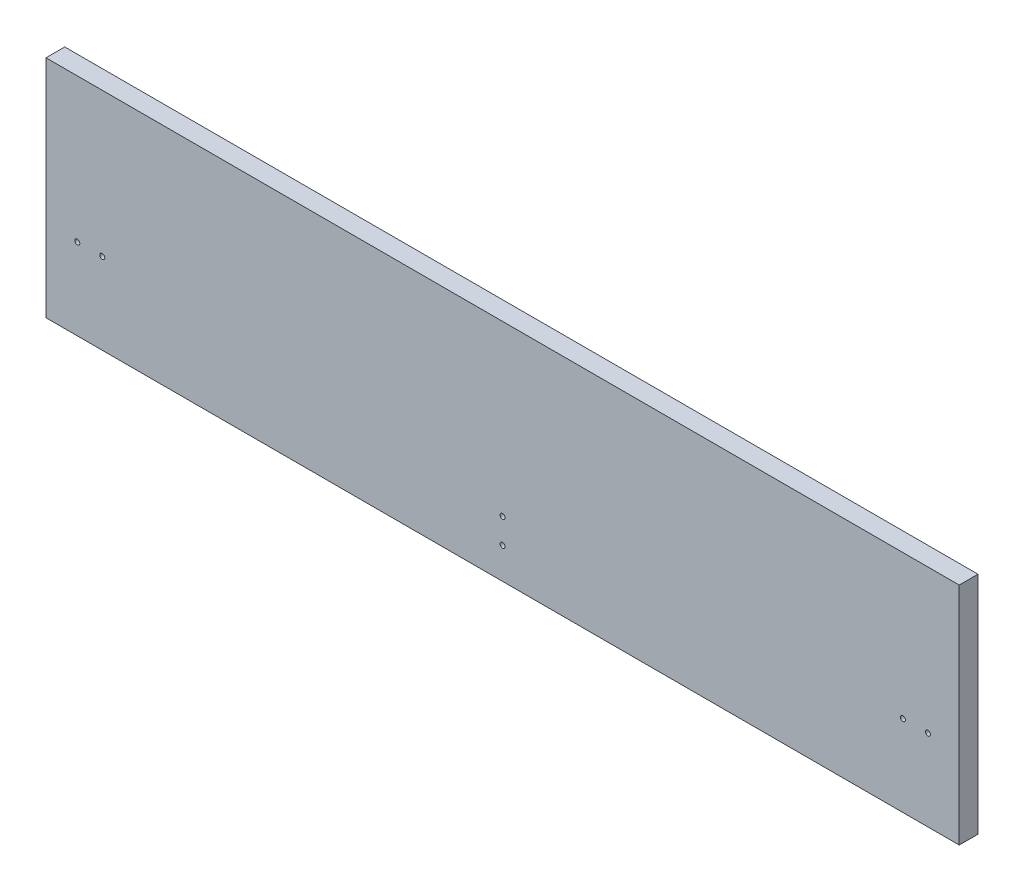
ISO-10303-21;
HEADER;
FILE_DESCRIPTION(('STEP AP214'),'2;1');
FILE_NAME('part.step','',(''),(''),'','','');
FILE_SCHEMA(('AUTOMOTIVE_DESIGN { 1 0 10303 214 1 1 1 1 }'));
ENDSEC;
DATA;
#1=APPLICATION_CONTEXT('core data for automotive mechanical design processes');
#2=APPLICATION_PROTOCOL_DEFINITION('international standard','automotive_design',2000,#1);
#3=PRODUCT_CONTEXT('',#1,'mechanical');
#4=PRODUCT('Part','Part','',(#3));
#5=PRODUCT_RELATED_PRODUCT_CATEGORY('part','',(#4));
#6=PRODUCT_DEFINITION_FORMATION('','',#4);
#7=PRODUCT_DEFINITION_CONTEXT('part definition',#1,'design');
#8=PRODUCT_DEFINITION('design','',#6,#7);
#9=PRODUCT_DEFINITION_SHAPE('','',#8);
#10=(LENGTH_UNIT() NAMED_UNIT(*) SI_UNIT(.MILLI.,.METRE.));
#11=(NAMED_UNIT(*) PLANE_ANGLE_UNIT() SI_UNIT($,.RADIAN.));
#12=(NAMED_UNIT(*) SI_UNIT($,.STERADIAN.) SOLID_ANGLE_UNIT());
#13=UNCERTAINTY_MEASURE_WITH_UNIT(LENGTH_MEASURE(1.E-05),#10,'distance_accuracy_value','');
#14=(GEOMETRIC_REPRESENTATION_CONTEXT(3) GLOBAL_UNCERTAINTY_ASSIGNED_CONTEXT((#13)) GLOBAL_UNIT_ASSIGNED_CONTEXT((#10,
#11,#12)) REPRESENTATION_CONTEXT('',''));
#15=CARTESIAN_POINT('',(0.,0.,0.));
#16=DIRECTION('',(0.,0.,1.));
#17=DIRECTION('',(1.,0.,0.));
#18=AXIS2_PLACEMENT_3D('',#15,#16,#17);
#19=CARTESIAN_POINT('',(365.,-90.,15.));
#20=DIRECTION('',(-1.,0.,0.));
#21=DIRECTION('',(0.,-1.,0.));
#22=AXIS2_PLACEMENT_3D('',#19,#20,#21);
#23=PLANE('',#22);
#24=DIRECTION('',(0.,1.,0.));
#25=VECTOR('',#24,1.);
#26=CARTESIAN_POINT('',(365.,-90.,0.));
#27=LINE('',#26,#25);
#28=CARTESIAN_POINT('',(365.,-90.,0.));
#29=VERTEX_POINT('',#28);
#30=CARTESIAN_POINT('',(365.,90.,0.));
#31=VERTEX_POINT('',#30);
#32=EDGE_CURVE('E95',#29,#31,#27,.T.);
#33=ORIENTED_EDGE('',*,*,#32,.T.);
#34=DIRECTION('',(0.,0.,-1.));
#35=VECTOR('',#34,1.);
#36=CARTESIAN_POINT('',(365.,90.,15.));
#37=LINE('',#36,#35);
#38=CARTESIAN_POINT('',(365.,90.,15.));
#39=VERTEX_POINT('',#38);
#40=EDGE_CURVE('E11',#39,#31,#37,.T.);
#41=ORIENTED_EDGE('',*,*,#40,.F.);
#42=DIRECTION('',(0.,1.,0.));
#43=VECTOR('',#42,1.);
#44=CARTESIAN_POINT('',(365.,-90.,15.));
#45=LINE('',#44,#43);
#46=CARTESIAN_POINT('',(365.,-90.,15.));
#47=VERTEX_POINT('',#46);
#48=EDGE_CURVE('E83',#47,#39,#45,.T.);
#49=ORIENTED_EDGE('',*,*,#48,.F.);
#50=DIRECTION('',(0.,0.,-1.));
#51=VECTOR('',#50,1.);
#52=CARTESIAN_POINT('',(365.,-90.,15.));
#53=LINE('',#52,#51);
#54=EDGE_CURVE('E91',#47,#29,#53,.T.);
#55=ORIENTED_EDGE('',*,*,#54,.T.);
#56=EDGE_LOOP('',(#33,#41,#49,#55));
#57=FACE_BOUND('',#56,.T.);
#58=ADVANCED_FACE('F32',(#57),#23,.F.);
#59=CARTESIAN_POINT('',(-365.,90.,15.));
#60=DIRECTION('',(0.,-1.,0.));
#61=DIRECTION('',(0.,0.,-1.));
#62=AXIS2_PLACEMENT_3D('',#59,#60,#61);
#63=PLANE('',#62);
#64=DIRECTION('',(-1.,0.,0.));
#65=VECTOR('',#64,1.);
#66=CARTESIAN_POINT('',(-365.,90.,0.));
#67=LINE('',#66,#65);
#68=CARTESIAN_POINT('',(-365.,90.,0.));
#69=VERTEX_POINT('',#68);
#70=EDGE_CURVE('E87',#31,#69,#67,.T.);
#71=ORIENTED_EDGE('',*,*,#70,.T.);
#72=DIRECTION('',(0.,0.,-1.));
#73=VECTOR('',#72,1.);
#74=CARTESIAN_POINT('',(-365.,90.,15.));
#75=LINE('',#74,#73);
#76=CARTESIAN_POINT('',(-365.,90.,15.));
#77=VERTEX_POINT('',#76);
#78=EDGE_CURVE('E40',#77,#69,#75,.T.);
#79=ORIENTED_EDGE('',*,*,#78,.F.);
#80=DIRECTION('',(-1.,0.,0.));
#81=VECTOR('',#80,1.);
#82=CARTESIAN_POINT('',(-365.,90.,15.));
#83=LINE('',#82,#81);
#84=EDGE_CURVE('E78',#39,#77,#83,.T.);
#85=ORIENTED_EDGE('',*,*,#84,.F.);
#86=ORIENTED_EDGE('',*,*,#40,.T.);
#87=EDGE_LOOP('',(#71,#79,#85,#86));
#88=FACE_BOUND('',#87,.T.);
#89=ADVANCED_FACE('F86',(#88),#63,.F.);
#90=CARTESIAN_POINT('',(-365.,-90.,15.));
#91=DIRECTION('',(1.,0.,0.));
#92=DIRECTION('',(0.,1.,0.));
#93=AXIS2_PLACEMENT_3D('',#90,#91,#92);
#94=PLANE('',#93);
#95=DIRECTION('',(0.,-1.,0.));
#96=VECTOR('',#95,1.);
#97=CARTESIAN_POINT('',(-365.,-90.,0.));
#98=LINE('',#97,#96);
#99=CARTESIAN_POINT('',(-365.,-90.,0.));
#100=VERTEX_POINT('',#99);
#101=EDGE_CURVE('E65',#69,#100,#98,.T.);
#102=ORIENTED_EDGE('',*,*,#101,.T.);
#103=DIRECTION('',(0.,0.,-1.));
#104=VECTOR('',#103,1.);
#105=CARTESIAN_POINT('',(-365.,-90.,15.));
#106=LINE('',#105,#104);
#107=CARTESIAN_POINT('',(-365.,-90.,15.));
#108=VERTEX_POINT('',#107);
#109=EDGE_CURVE('E88',#108,#100,#106,.T.);
#110=ORIENTED_EDGE('',*,*,#109,.F.);
#111=DIRECTION('',(0.,-1.,0.));
#112=VECTOR('',#111,1.);
#113=CARTESIAN_POINT('',(-365.,-90.,15.));
#114=LINE('',#113,#112);
#115=EDGE_CURVE('E81',#77,#108,#114,.T.);
#116=ORIENTED_EDGE('',*,*,#115,.F.);
#117=ORIENTED_EDGE('',*,*,#78,.T.);
#118=EDGE_LOOP('',(#102,#110,#116,#117));
#119=FACE_BOUND('',#118,.T.);
#120=ADVANCED_FACE('F89',(#119),#94,.F.);
#121=CARTESIAN_POINT('',(-365.,-90.,15.));
#122=DIRECTION('',(0.,1.,0.));
#123=DIRECTION('',(0.,0.,1.));
#124=AXIS2_PLACEMENT_3D('',#121,#122,#123);
#125=PLANE('',#124);
#126=DIRECTION('',(1.,0.,0.));
#127=VECTOR('',#126,1.);
#128=CARTESIAN_POINT('',(-365.,-90.,0.));
#129=LINE('',#128,#127);
#130=EDGE_CURVE('E71',#100,#29,#129,.T.);
#131=ORIENTED_EDGE('',*,*,#130,.T.);
#132=ORIENTED_EDGE('',*,*,#54,.F.);
#133=DIRECTION('',(1.,0.,0.));
#134=VECTOR('',#133,1.);
#135=CARTESIAN_POINT('',(-365.,-90.,15.));
#136=LINE('',#135,#134);
#137=EDGE_CURVE('E48',#108,#47,#136,.T.);
#138=ORIENTED_EDGE('',*,*,#137,.F.);
#139=ORIENTED_EDGE('',*,*,#109,.T.);
#140=EDGE_LOOP('',(#131,#132,#138,#139));
#141=FACE_BOUND('',#140,.T.);
#142=ADVANCED_FACE('F103',(#141),#125,.F.);
#143=CARTESIAN_POINT('',(0.,0.,15.));
#144=DIRECTION('',(0.,0.,-1.));
#145=DIRECTION('',(-1.,0.,0.));
#146=AXIS2_PLACEMENT_3D('',#143,#144,#145);
#147=PLANE('',#146);
#148=CARTESIAN_POINT('',(320.,-24.9999999999999,15.));
#149=DIRECTION('',(0.,0.,1.));
#150=DIRECTION('',(1.,0.,0.));
#151=AXIS2_PLACEMENT_3D('',#148,#149,#150);
#152=CIRCLE('',#151,2.);
#153=CARTESIAN_POINT('',(322.,-24.9999999999999,15.));
#154=VERTEX_POINT('',#153);
#155=EDGE_CURVE('E139',#154,#154,#152,.T.);
#156=ORIENTED_EDGE('',*,*,#155,.F.);
#157=EDGE_LOOP('',(#156));
#158=FACE_BOUND('',#157,.T.);
#159=CARTESIAN_POINT('',(340.,-25.,15.));
#160=DIRECTION('',(0.,0.,1.));
#161=DIRECTION('',(1.,0.,0.));
#162=AXIS2_PLACEMENT_3D('',#159,#160,#161);
#163=CIRCLE('',#162,2.);
#164=CARTESIAN_POINT('',(342.,-25.,15.));
#165=VERTEX_POINT('',#164);
#166=EDGE_CURVE('E133',#165,#165,#163,.T.);
#167=ORIENTED_EDGE('',*,*,#166,.F.);
#168=EDGE_LOOP('',(#167));
#169=FACE_BOUND('',#168,.T.);
#170=CARTESIAN_POINT('',(-320.,-25.,15.));
#171=DIRECTION('',(0.,0.,1.));
#172=DIRECTION('',(1.,0.,0.));
#173=AXIS2_PLACEMENT_3D('',#170,#171,#172);
#174=CIRCLE('',#173,2.);
#175=CARTESIAN_POINT('',(-318.,-25.,15.));
#176=VERTEX_POINT('',#175);
#177=EDGE_CURVE('E127',#176,#176,#174,.T.);
#178=ORIENTED_EDGE('',*,*,#177,.F.);
#179=EDGE_LOOP('',(#178));
#180=FACE_BOUND('',#179,.T.);
#181=CARTESIAN_POINT('',(0.,-45.,15.));
#182=DIRECTION('',(0.,0.,1.));
#183=DIRECTION('',(1.,0.,0.));
#184=AXIS2_PLACEMENT_3D('',#181,#182,#183);
#185=CIRCLE('',#184,2.);
#186=CARTESIAN_POINT('',(2.,-45.,15.));
#187=VERTEX_POINT('',#186);
#188=EDGE_CURVE('E121',#187,#187,#185,.T.);
#189=ORIENTED_EDGE('',*,*,#188,.F.);
#190=EDGE_LOOP('',(#189));
#191=FACE_BOUND('',#190,.T.);
#192=CARTESIAN_POINT('',(0.,-65.,15.));
#193=DIRECTION('',(0.,0.,1.));
#194=DIRECTION('',(1.,0.,0.));
#195=AXIS2_PLACEMENT_3D('',#192,#193,#194);
#196=CIRCLE('',#195,2.);
#197=CARTESIAN_POINT('',(2.,-65.,15.));
#198=VERTEX_POINT('',#197);
#199=EDGE_CURVE('E115',#198,#198,#196,.T.);
#200=ORIENTED_EDGE('',*,*,#199,.F.);
#201=EDGE_LOOP('',(#200));
#202=FACE_BOUND('',#201,.T.);
#203=CARTESIAN_POINT('',(-340.,-25.,15.));
#204=DIRECTION('',(0.,0.,1.));
#205=DIRECTION('',(1.,0.,0.));
#206=AXIS2_PLACEMENT_3D('',#203,#204,#205);
#207=CIRCLE('',#206,2.);
#208=CARTESIAN_POINT('',(-338.,-25.,15.));
#209=VERTEX_POINT('',#208);
#210=EDGE_CURVE('E109',#209,#209,#207,.T.);
#211=ORIENTED_EDGE('',*,*,#210,.F.);
#212=EDGE_LOOP('',(#211));
#213=FACE_BOUND('',#212,.T.);
#214=ORIENTED_EDGE('',*,*,#48,.T.);
#215=ORIENTED_EDGE('',*,*,#84,.T.);
#216=ORIENTED_EDGE('',*,*,#115,.T.);
#217=ORIENTED_EDGE('',*,*,#137,.T.);
#218=EDGE_LOOP('',(#214,#215,#216,#217));
#219=FACE_BOUND('',#218,.T.);
#220=ADVANCED_FACE('F79',(#158,#169,#180,#191,#202,#213,#219),#147,.F.);
#221=CARTESIAN_POINT('',(0.,0.,0.));
#222=DIRECTION('',(0.,0.,-1.));
#223=DIRECTION('',(-1.,0.,0.));
#224=AXIS2_PLACEMENT_3D('',#221,#222,#223);
#225=PLANE('',#224);
#226=ORIENTED_EDGE('',*,*,#32,.F.);
#227=ORIENTED_EDGE('',*,*,#130,.F.);
#228=ORIENTED_EDGE('',*,*,#101,.F.);
#229=ORIENTED_EDGE('',*,*,#70,.F.);
#230=EDGE_LOOP('',(#226,#227,#228,#229));
#231=FACE_BOUND('',#230,.T.);
#232=ADVANCED_FACE('F106',(#231),#225,.T.);
#233=CARTESIAN_POINT('',(-340.,-25.,5.));
#234=DIRECTION('',(0.,0.,1.));
#235=DIRECTION('',(1.,0.,0.));
#236=AXIS2_PLACEMENT_3D('',#233,#234,#235);
#237=CYLINDRICAL_SURFACE('',#236,2.);
#238=CARTESIAN_POINT('',(-340.,-25.,5.));
#239=DIRECTION('',(0.,0.,1.));
#240=DIRECTION('',(1.,0.,0.));
#241=AXIS2_PLACEMENT_3D('',#238,#239,#240);
#242=CIRCLE('',#241,2.);
#243=CARTESIAN_POINT('',(-338.,-25.,5.));
#244=VERTEX_POINT('',#243);
#245=EDGE_CURVE('E98',#244,#244,#242,.T.);
#246=ORIENTED_EDGE('',*,*,#245,.F.);
#247=EDGE_LOOP('',(#246));
#248=FACE_BOUND('',#247,.T.);
#249=ORIENTED_EDGE('',*,*,#210,.T.);
#250=EDGE_LOOP('',(#249));
#251=FACE_BOUND('',#250,.T.);
#252=ADVANCED_FACE('F167',(#248,#251),#237,.F.);
#253=CARTESIAN_POINT('',(-340.,-25.,5.));
#254=DIRECTION('',(0.,0.,1.));
#255=DIRECTION('',(1.,0.,0.));
#256=AXIS2_PLACEMENT_3D('',#253,#254,#255);
#257=PLANE('',#256);
#258=ORIENTED_EDGE('',*,*,#245,.T.);
#259=EDGE_LOOP('',(#258));
#260=FACE_BOUND('',#259,.T.);
#261=ADVANCED_FACE('F169',(#260),#257,.T.);
#262=CARTESIAN_POINT('',(0.,-65.,5.));
#263=DIRECTION('',(0.,0.,1.));
#264=DIRECTION('',(1.,0.,0.));
#265=AXIS2_PLACEMENT_3D('',#262,#263,#264);
#266=CYLINDRICAL_SURFACE('',#265,2.);
#267=CARTESIAN_POINT('',(0.,-65.,5.));
#268=DIRECTION('',(0.,0.,1.));
#269=DIRECTION('',(1.,0.,0.));
#270=AXIS2_PLACEMENT_3D('',#267,#268,#269);
#271=CIRCLE('',#270,2.);
#272=CARTESIAN_POINT('',(2.,-65.,5.));
#273=VERTEX_POINT('',#272);
#274=EDGE_CURVE('E112',#273,#273,#271,.T.);
#275=ORIENTED_EDGE('',*,*,#274,.F.);
#276=EDGE_LOOP('',(#275));
#277=FACE_BOUND('',#276,.T.);
#278=ORIENTED_EDGE('',*,*,#199,.T.);
#279=EDGE_LOOP('',(#278));
#280=FACE_BOUND('',#279,.T.);
#281=ADVANCED_FACE('F176',(#277,#280),#266,.F.);
#282=CARTESIAN_POINT('',(0.,-65.,5.));
#283=DIRECTION('',(0.,0.,1.));
#284=DIRECTION('',(1.,0.,0.));
#285=AXIS2_PLACEMENT_3D('',#282,#283,#284);
#286=PLANE('',#285);
#287=ORIENTED_EDGE('',*,*,#274,.T.);
#288=EDGE_LOOP('',(#287));
#289=FACE_BOUND('',#288,.T.);
#290=ADVANCED_FACE('F224',(#289),#286,.T.);
#291=CARTESIAN_POINT('',(0.,-45.,5.));
#292=DIRECTION('',(0.,0.,1.));
#293=DIRECTION('',(1.,0.,0.));
#294=AXIS2_PLACEMENT_3D('',#291,#292,#293);
#295=CYLINDRICAL_SURFACE('',#294,2.);
#296=CARTESIAN_POINT('',(0.,-45.,5.));
#297=DIRECTION('',(0.,0.,1.));
#298=DIRECTION('',(1.,0.,0.));
#299=AXIS2_PLACEMENT_3D('',#296,#297,#298);
#300=CIRCLE('',#299,2.);
#301=CARTESIAN_POINT('',(2.,-45.,5.));
#302=VERTEX_POINT('',#301);
#303=EDGE_CURVE('E118',#302,#302,#300,.T.);
#304=ORIENTED_EDGE('',*,*,#303,.F.);
#305=EDGE_LOOP('',(#304));
#306=FACE_BOUND('',#305,.T.);
#307=ORIENTED_EDGE('',*,*,#188,.T.);
#308=EDGE_LOOP('',(#307));
#309=FACE_BOUND('',#308,.T.);
#310=ADVANCED_FACE('F233',(#306,#309),#295,.F.);
#311=CARTESIAN_POINT('',(0.,-45.,5.));
#312=DIRECTION('',(0.,0.,1.));
#313=DIRECTION('',(1.,0.,0.));
#314=AXIS2_PLACEMENT_3D('',#311,#312,#313);
#315=PLANE('',#314);
#316=ORIENTED_EDGE('',*,*,#303,.T.);
#317=EDGE_LOOP('',(#316));
#318=FACE_BOUND('',#317,.T.);
#319=ADVANCED_FACE('F242',(#318),#315,.T.);
#320=CARTESIAN_POINT('',(-320.,-25.,5.));
#321=DIRECTION('',(0.,0.,1.));
#322=DIRECTION('',(1.,0.,0.));
#323=AXIS2_PLACEMENT_3D('',#320,#321,#322);
#324=CYLINDRICAL_SURFACE('',#323,2.);
#325=CARTESIAN_POINT('',(-320.,-25.,5.));
#326=DIRECTION('',(0.,0.,1.));
#327=DIRECTION('',(1.,0.,0.));
#328=AXIS2_PLACEMENT_3D('',#325,#326,#327);
#329=CIRCLE('',#328,2.);
#330=CARTESIAN_POINT('',(-318.,-25.,5.));
#331=VERTEX_POINT('',#330);
#332=EDGE_CURVE('E124',#331,#331,#329,.T.);
#333=ORIENTED_EDGE('',*,*,#332,.F.);
#334=EDGE_LOOP('',(#333));
#335=FACE_BOUND('',#334,.T.);
#336=ORIENTED_EDGE('',*,*,#177,.T.);
#337=EDGE_LOOP('',(#336));
#338=FACE_BOUND('',#337,.T.);
#339=ADVANCED_FACE('F251',(#335,#338),#324,.F.);
#340=CARTESIAN_POINT('',(-320.,-25.,5.));
#341=DIRECTION('',(0.,0.,1.));
#342=DIRECTION('',(1.,0.,0.));
#343=AXIS2_PLACEMENT_3D('',#340,#341,#342);
#344=PLANE('',#343);
#345=ORIENTED_EDGE('',*,*,#332,.T.);
#346=EDGE_LOOP('',(#345));
#347=FACE_BOUND('',#346,.T.);
#348=ADVANCED_FACE('F260',(#347),#344,.T.);
#349=CARTESIAN_POINT('',(340.,-25.,5.));
#350=DIRECTION('',(0.,0.,1.));
#351=DIRECTION('',(1.,0.,0.));
#352=AXIS2_PLACEMENT_3D('',#349,#350,#351);
#353=CYLINDRICAL_SURFACE('',#352,2.);
#354=CARTESIAN_POINT('',(340.,-25.,5.));
#355=DIRECTION('',(0.,0.,1.));
#356=DIRECTION('',(1.,0.,0.));
#357=AXIS2_PLACEMENT_3D('',#354,#355,#356);
#358=CIRCLE('',#357,2.);
#359=CARTESIAN_POINT('',(342.,-25.,5.));
#360=VERTEX_POINT('',#359);
#361=EDGE_CURVE('E130',#360,#360,#358,.T.);
#362=ORIENTED_EDGE('',*,*,#361,.F.);
#363=EDGE_LOOP('',(#362));
#364=FACE_BOUND('',#363,.T.);
#365=ORIENTED_EDGE('',*,*,#166,.T.);
#366=EDGE_LOOP('',(#365));
#367=FACE_BOUND('',#366,.T.);
#368=ADVANCED_FACE('F269',(#364,#367),#353,.F.);
#369=CARTESIAN_POINT('',(340.,-25.,5.));
#370=DIRECTION('',(0.,0.,1.));
#371=DIRECTION('',(1.,0.,0.));
#372=AXIS2_PLACEMENT_3D('',#369,#370,#371);
#373=PLANE('',#372);
#374=ORIENTED_EDGE('',*,*,#361,.T.);
#375=EDGE_LOOP('',(#374));
#376=FACE_BOUND('',#375,.T.);
#377=ADVANCED_FACE('F150',(#376),#373,.T.);
#378=CARTESIAN_POINT('',(320.,-24.9999999999999,5.));
#379=DIRECTION('',(0.,0.,1.));
#380=DIRECTION('',(1.,0.,0.));
#381=AXIS2_PLACEMENT_3D('',#378,#379,#380);
#382=CYLINDRICAL_SURFACE('',#381,2.);
#383=CARTESIAN_POINT('',(320.,-24.9999999999999,5.));
#384=DIRECTION('',(0.,0.,1.));
#385=DIRECTION('',(1.,0.,0.));
#386=AXIS2_PLACEMENT_3D('',#383,#384,#385);
#387=CIRCLE('',#386,2.);
#388=CARTESIAN_POINT('',(322.,-24.9999999999999,5.));
#389=VERTEX_POINT('',#388);
#390=EDGE_CURVE('E136',#389,#389,#387,.T.);
#391=ORIENTED_EDGE('',*,*,#390,.F.);
#392=EDGE_LOOP('',(#391));
#393=FACE_BOUND('',#392,.T.);
#394=ORIENTED_EDGE('',*,*,#155,.T.);
#395=EDGE_LOOP('',(#394));
#396=FACE_BOUND('',#395,.T.);
#397=ADVANCED_FACE('F147',(#393,#396),#382,.F.);
#398=CARTESIAN_POINT('',(320.,-24.9999999999999,5.));
#399=DIRECTION('',(0.,0.,1.));
#400=DIRECTION('',(1.,0.,0.));
#401=AXIS2_PLACEMENT_3D('',#398,#399,#400);
#402=PLANE('',#401);
#403=ORIENTED_EDGE('',*,*,#390,.T.);
#404=EDGE_LOOP('',(#403));
#405=FACE_BOUND('',#404,.T.);
#406=ADVANCED_FACE('F145',(#405),#402,.T.);
#407=CLOSED_SHELL('',(#58,#89,#120,#142,#220,#232,#252,#261,#281,#290,#310,#319,#339,#348,#368,
#377,#397,#406));
#408=MANIFOLD_SOLID_BREP('B2',#407);
#409=ADVANCED_BREP_SHAPE_REPRESENTATION('',(#18,#408),#14);
#410=SHAPE_DEFINITION_REPRESENTATION(#9,#409);
ENDSEC;
END-ISO-10303-21;
